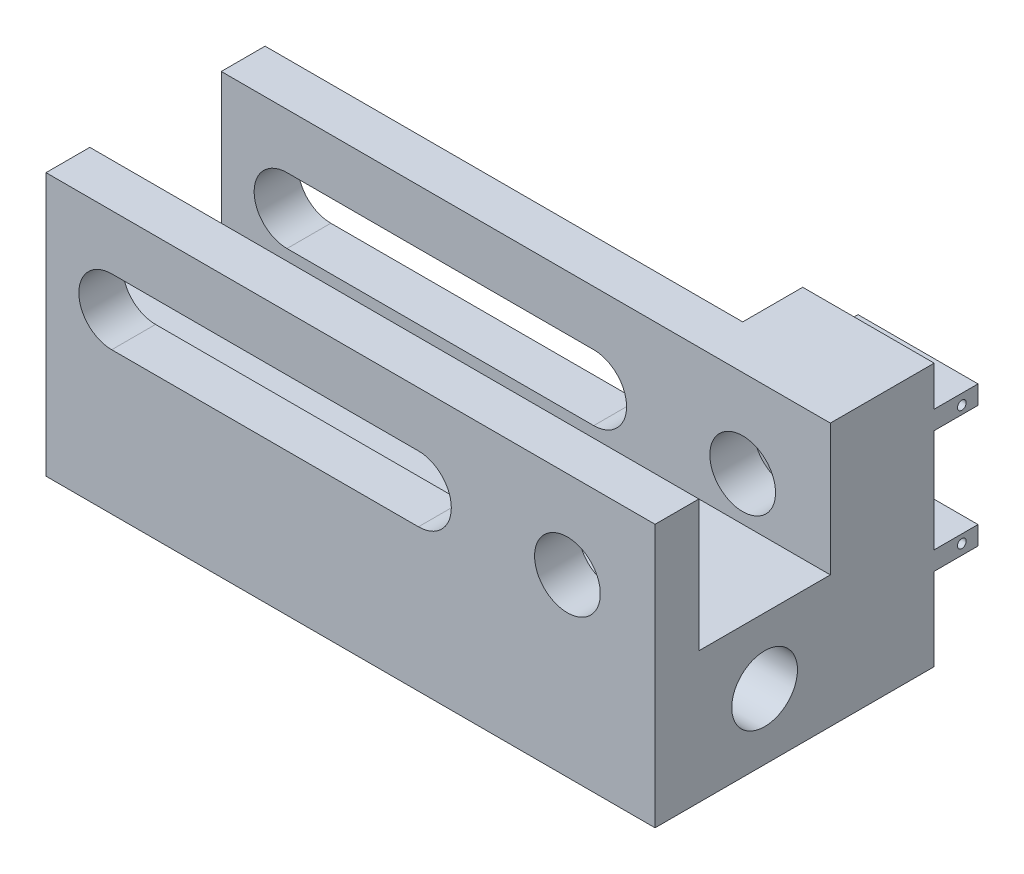
ISO-10303-21;
HEADER;
FILE_DESCRIPTION(('STEP AP214'),'2;1');
FILE_NAME('part.step','',(''),(''),'','','');
FILE_SCHEMA(('AUTOMOTIVE_DESIGN { 1 0 10303 214 1 1 1 1 }'));
ENDSEC;
DATA;
#1=APPLICATION_CONTEXT('core data for automotive mechanical design processes');
#2=APPLICATION_PROTOCOL_DEFINITION('international standard','automotive_design',2000,#1);
#3=PRODUCT_CONTEXT('',#1,'mechanical');
#4=PRODUCT('Part','Part','',(#3));
#5=PRODUCT_RELATED_PRODUCT_CATEGORY('part','',(#4));
#6=PRODUCT_DEFINITION_FORMATION('','',#4);
#7=PRODUCT_DEFINITION_CONTEXT('part definition',#1,'design');
#8=PRODUCT_DEFINITION('design','',#6,#7);
#9=PRODUCT_DEFINITION_SHAPE('','',#8);
#10=(LENGTH_UNIT() NAMED_UNIT(*) SI_UNIT(.MILLI.,.METRE.));
#11=(NAMED_UNIT(*) PLANE_ANGLE_UNIT() SI_UNIT($,.RADIAN.));
#12=(NAMED_UNIT(*) SI_UNIT($,.STERADIAN.) SOLID_ANGLE_UNIT());
#13=UNCERTAINTY_MEASURE_WITH_UNIT(LENGTH_MEASURE(1.E-05),#10,'distance_accuracy_value','');
#14=(GEOMETRIC_REPRESENTATION_CONTEXT(3) GLOBAL_UNCERTAINTY_ASSIGNED_CONTEXT((#13)) GLOBAL_UNIT_ASSIGNED_CONTEXT((#10,
#11,#12)) REPRESENTATION_CONTEXT('',''));
#15=CARTESIAN_POINT('',(0.,0.,0.));
#16=DIRECTION('',(0.,0.,1.));
#17=DIRECTION('',(1.,0.,0.));
#18=AXIS2_PLACEMENT_3D('',#15,#16,#17);
#19=CARTESIAN_POINT('',(0.,0.,-38.7));
#20=DIRECTION('',(0.,0.,1.));
#21=DIRECTION('',(1.,0.,0.));
#22=AXIS2_PLACEMENT_3D('',#19,#20,#21);
#23=PLANE('',#22);
#24=DIRECTION('',(-1.,0.,0.));
#25=VECTOR('',#24,1.);
#26=CARTESIAN_POINT('',(0.,18.8499999999997,-38.7));
#27=LINE('',#26,#25);
#28=CARTESIAN_POINT('',(139.,18.85,-38.7));
#29=VERTEX_POINT('',#28);
#30=CARTESIAN_POINT('',(111.417721642696,18.8499999999999,-38.7));
#31=VERTEX_POINT('',#30);
#32=EDGE_CURVE('E238',#29,#31,#27,.T.);
#33=ORIENTED_EDGE('',*,*,#32,.F.);
#34=DIRECTION('',(0.,-1.,0.));
#35=VECTOR('',#34,1.);
#36=CARTESIAN_POINT('',(139.,0.,-38.7));
#37=LINE('',#36,#35);
#38=CARTESIAN_POINT('',(139.,0.,-38.7));
#39=VERTEX_POINT('',#38);
#40=EDGE_CURVE('E242',#29,#39,#37,.T.);
#41=ORIENTED_EDGE('',*,*,#40,.T.);
#42=DIRECTION('',(-1.,0.,0.));
#43=VECTOR('',#42,1.);
#44=CARTESIAN_POINT('',(139.,0.,-38.7));
#45=LINE('',#44,#43);
#46=CARTESIAN_POINT('',(109.,0.,-38.7));
#47=VERTEX_POINT('',#46);
#48=EDGE_CURVE('E276',#39,#47,#45,.T.);
#49=ORIENTED_EDGE('',*,*,#48,.T.);
#50=DIRECTION('',(0.,1.,0.));
#51=VECTOR('',#50,1.);
#52=CARTESIAN_POINT('',(109.,0.,-38.7));
#53=LINE('',#52,#51);
#54=CARTESIAN_POINT('',(109.,60.,-38.7));
#55=VERTEX_POINT('',#54);
#56=EDGE_CURVE('E279',#47,#55,#53,.T.);
#57=ORIENTED_EDGE('',*,*,#56,.T.);
#58=DIRECTION('',(1.,0.,0.));
#59=VECTOR('',#58,1.);
#60=CARTESIAN_POINT('',(139.,60.,-38.7));
#61=LINE('',#60,#59);
#62=CARTESIAN_POINT('',(139.,60.,-38.7));
#63=VERTEX_POINT('',#62);
#64=EDGE_CURVE('E281',#55,#63,#61,.T.);
#65=ORIENTED_EDGE('',*,*,#64,.T.);
#66=CARTESIAN_POINT('',(139.,50.9,-38.7));
#67=VERTEX_POINT('',#66);
#68=EDGE_CURVE('E273',#63,#67,#37,.T.);
#69=ORIENTED_EDGE('',*,*,#68,.T.);
#70=DIRECTION('',(-1.,0.,0.));
#71=VECTOR('',#70,1.);
#72=CARTESIAN_POINT('',(-1.03187819537934E-13,50.8999999999997,-38.7));
#73=LINE('',#72,#71);
#74=CARTESIAN_POINT('',(111.617721642696,50.8999999999999,-38.7));
#75=VERTEX_POINT('',#74);
#76=EDGE_CURVE('E261',#67,#75,#73,.T.);
#77=ORIENTED_EDGE('',*,*,#76,.T.);
#78=DIRECTION('',(0.,-1.,0.));
#79=VECTOR('',#78,1.);
#80=CARTESIAN_POINT('',(111.617721642696,0.,-38.7));
#81=LINE('',#80,#79);
#82=CARTESIAN_POINT('',(111.617721642696,46.6499999999999,-38.7));
#83=VERTEX_POINT('',#82);
#84=EDGE_CURVE('E66',#75,#83,#81,.T.);
#85=ORIENTED_EDGE('',*,*,#84,.T.);
#86=DIRECTION('',(-1.,0.,0.));
#87=VECTOR('',#86,1.);
#88=CARTESIAN_POINT('',(0.,46.6499999999997,-38.7));
#89=LINE('',#88,#87);
#90=CARTESIAN_POINT('',(139.,46.65,-38.7));
#91=VERTEX_POINT('',#90);
#92=EDGE_CURVE('E252',#91,#83,#89,.T.);
#93=ORIENTED_EDGE('',*,*,#92,.F.);
#94=CARTESIAN_POINT('',(139.,23.1,-38.7));
#95=VERTEX_POINT('',#94);
#96=EDGE_CURVE('E277',#91,#95,#37,.T.);
#97=ORIENTED_EDGE('',*,*,#96,.T.);
#98=DIRECTION('',(-1.,0.,0.));
#99=VECTOR('',#98,1.);
#100=CARTESIAN_POINT('',(0.,23.0999999999997,-38.7));
#101=LINE('',#100,#99);
#102=CARTESIAN_POINT('',(111.417721642696,23.0999999999999,-38.7));
#103=VERTEX_POINT('',#102);
#104=EDGE_CURVE('E235',#95,#103,#101,.T.);
#105=ORIENTED_EDGE('',*,*,#104,.T.);
#106=DIRECTION('',(0.,1.,0.));
#107=VECTOR('',#106,1.);
#108=CARTESIAN_POINT('',(111.417721642696,0.,-38.7));
#109=LINE('',#108,#107);
#110=EDGE_CURVE('E58',#31,#103,#109,.T.);
#111=ORIENTED_EDGE('',*,*,#110,.F.);
#112=EDGE_LOOP('',(#33,#41,#49,#57,#65,#69,#77,#85,#93,#97,#105,#111));
#113=FACE_BOUND('',#112,.T.);
#114=ADVANCED_FACE('F41',(#113),#23,.F.);
#115=CARTESIAN_POINT('',(139.,51.1347174362356,-25.));
#116=DIRECTION('',(0.,0.,1.));
#117=DIRECTION('',(1.,0.,0.));
#118=AXIS2_PLACEMENT_3D('',#115,#116,#117);
#119=PLANE('',#118);
#120=DIRECTION('',(-1.,0.,0.));
#121=VECTOR('',#120,1.);
#122=CARTESIAN_POINT('',(85.,32.5,-25.));
#123=LINE('',#122,#121);
#124=CARTESIAN_POINT('',(85.,32.5,-25.));
#125=VERTEX_POINT('',#124);
#126=CARTESIAN_POINT('',(15.,32.5,-25.));
#127=VERTEX_POINT('',#126);
#128=EDGE_CURVE('E327',#125,#127,#123,.T.);
#129=ORIENTED_EDGE('',*,*,#128,.F.);
#130=CARTESIAN_POINT('',(85.,40.,-25.));
#131=DIRECTION('',(0.,0.,-1.));
#132=DIRECTION('',(-1.,0.,0.));
#133=AXIS2_PLACEMENT_3D('',#130,#131,#132);
#134=CIRCLE('',#133,7.5);
#135=CARTESIAN_POINT('',(85.,47.5,-25.));
#136=VERTEX_POINT('',#135);
#137=EDGE_CURVE('E302',#136,#125,#134,.T.);
#138=ORIENTED_EDGE('',*,*,#137,.F.);
#139=DIRECTION('',(1.,0.,0.));
#140=VECTOR('',#139,1.);
#141=CARTESIAN_POINT('',(85.,47.5,-25.));
#142=LINE('',#141,#140);
#143=CARTESIAN_POINT('',(15.,47.5,-25.));
#144=VERTEX_POINT('',#143);
#145=EDGE_CURVE('E320',#144,#136,#142,.T.);
#146=ORIENTED_EDGE('',*,*,#145,.F.);
#147=CARTESIAN_POINT('',(15.,40.,-25.));
#148=DIRECTION('',(0.,0.,-1.));
#149=DIRECTION('',(-1.,0.,0.));
#150=AXIS2_PLACEMENT_3D('',#147,#148,#149);
#151=CIRCLE('',#150,7.5);
#152=EDGE_CURVE('E323',#127,#144,#151,.T.);
#153=ORIENTED_EDGE('',*,*,#152,.F.);
#154=EDGE_LOOP('',(#129,#138,#146,#153));
#155=FACE_BOUND('',#154,.T.);
#156=DIRECTION('',(0.,1.,0.));
#157=VECTOR('',#156,1.);
#158=CARTESIAN_POINT('',(109.,0.,-25.));
#159=LINE('',#158,#157);
#160=CARTESIAN_POINT('',(109.,0.,-25.));
#161=VERTEX_POINT('',#160);
#162=CARTESIAN_POINT('',(109.,60.,-25.));
#163=VERTEX_POINT('',#162);
#164=EDGE_CURVE('E239',#161,#163,#159,.T.);
#165=ORIENTED_EDGE('',*,*,#164,.F.);
#166=DIRECTION('',(-1.,0.,0.));
#167=VECTOR('',#166,1.);
#168=CARTESIAN_POINT('',(139.,0.,-25.));
#169=LINE('',#168,#167);
#170=CARTESIAN_POINT('',(0.,0.,-25.));
#171=VERTEX_POINT('',#170);
#172=EDGE_CURVE('E387',#161,#171,#169,.T.);
#173=ORIENTED_EDGE('',*,*,#172,.T.);
#174=DIRECTION('',(0.,1.,0.));
#175=VECTOR('',#174,1.);
#176=CARTESIAN_POINT('',(0.,51.1347174362356,-25.));
#177=LINE('',#176,#175);
#178=CARTESIAN_POINT('',(0.,60.,-25.));
#179=VERTEX_POINT('',#178);
#180=EDGE_CURVE('E370',#171,#179,#177,.T.);
#181=ORIENTED_EDGE('',*,*,#180,.T.);
#182=DIRECTION('',(-1.,0.,0.));
#183=VECTOR('',#182,1.);
#184=CARTESIAN_POINT('',(139.,60.,-25.));
#185=LINE('',#184,#183);
#186=EDGE_CURVE('E11',#163,#179,#185,.T.);
#187=ORIENTED_EDGE('',*,*,#186,.F.);
#188=EDGE_LOOP('',(#165,#173,#181,#187));
#189=FACE_BOUND('',#188,.T.);
#190=ADVANCED_FACE('F43',(#155,#189),#119,.F.);
#191=CARTESIAN_POINT('',(139.,60.,-25.));
#192=DIRECTION('',(0.,-1.,0.));
#193=DIRECTION('',(0.,0.,-1.));
#194=AXIS2_PLACEMENT_3D('',#191,#192,#193);
#195=PLANE('',#194);
#196=DIRECTION('',(0.,0.,1.));
#197=VECTOR('',#196,1.);
#198=CARTESIAN_POINT('',(0.,60.,-25.));
#199=LINE('',#198,#197);
#200=CARTESIAN_POINT('',(0.,60.,-15.));
#201=VERTEX_POINT('',#200);
#202=EDGE_CURVE('E390',#179,#201,#199,.T.);
#203=ORIENTED_EDGE('',*,*,#202,.T.);
#204=DIRECTION('',(-1.,0.,0.));
#205=VECTOR('',#204,1.);
#206=CARTESIAN_POINT('',(139.,60.,-15.));
#207=LINE('',#206,#205);
#208=CARTESIAN_POINT('',(139.,60.,-15.));
#209=VERTEX_POINT('',#208);
#210=EDGE_CURVE('E50',#209,#201,#207,.T.);
#211=ORIENTED_EDGE('',*,*,#210,.F.);
#212=DIRECTION('',(0.,0.,1.));
#213=VECTOR('',#212,1.);
#214=CARTESIAN_POINT('',(139.,60.,-25.));
#215=LINE('',#214,#213);
#216=EDGE_CURVE('E371',#63,#209,#215,.T.);
#217=ORIENTED_EDGE('',*,*,#216,.F.);
#218=ORIENTED_EDGE('',*,*,#64,.F.);
#219=DIRECTION('',(0.,0.,1.));
#220=VECTOR('',#219,1.);
#221=CARTESIAN_POINT('',(109.,60.,-38.7));
#222=LINE('',#221,#220);
#223=EDGE_CURVE('E283',#55,#163,#222,.T.);
#224=ORIENTED_EDGE('',*,*,#223,.T.);
#225=ORIENTED_EDGE('',*,*,#186,.T.);
#226=EDGE_LOOP('',(#203,#211,#217,#218,#224,#225));
#227=FACE_BOUND('',#226,.T.);
#228=ADVANCED_FACE('F494',(#227),#195,.F.);
#229=CARTESIAN_POINT('',(139.,30.,-15.));
#230=DIRECTION('',(0.,0.,-1.));
#231=DIRECTION('',(-1.,0.,0.));
#232=AXIS2_PLACEMENT_3D('',#229,#230,#231);
#233=PLANE('',#232);
#234=CARTESIAN_POINT('',(119.,40.,-15.));
#235=DIRECTION('',(0.,0.,-1.));
#236=DIRECTION('',(-1.,0.,0.));
#237=AXIS2_PLACEMENT_3D('',#234,#235,#236);
#238=CIRCLE('',#237,7.49999999999998);
#239=CARTESIAN_POINT('',(111.5,40.,-15.));
#240=VERTEX_POINT('',#239);
#241=EDGE_CURVE('E367',#240,#240,#238,.T.);
#242=ORIENTED_EDGE('',*,*,#241,.T.);
#243=EDGE_LOOP('',(#242));
#244=FACE_BOUND('',#243,.T.);
#245=DIRECTION('',(1.,0.,0.));
#246=VECTOR('',#245,1.);
#247=CARTESIAN_POINT('',(139.,47.5,-15.));
#248=LINE('',#247,#246);
#249=CARTESIAN_POINT('',(15.,47.5,-15.));
#250=VERTEX_POINT('',#249);
#251=CARTESIAN_POINT('',(85.,47.5,-15.));
#252=VERTEX_POINT('',#251);
#253=EDGE_CURVE('E355',#250,#252,#248,.T.);
#254=ORIENTED_EDGE('',*,*,#253,.T.);
#255=CARTESIAN_POINT('',(85.,40.,-15.));
#256=DIRECTION('',(0.,0.,-1.));
#257=DIRECTION('',(-1.,0.,0.));
#258=AXIS2_PLACEMENT_3D('',#255,#256,#257);
#259=CIRCLE('',#258,7.5);
#260=CARTESIAN_POINT('',(85.,32.5,-15.));
#261=VERTEX_POINT('',#260);
#262=EDGE_CURVE('E361',#252,#261,#259,.T.);
#263=ORIENTED_EDGE('',*,*,#262,.T.);
#264=DIRECTION('',(-1.,0.,0.));
#265=VECTOR('',#264,1.);
#266=CARTESIAN_POINT('',(139.,32.5,-15.));
#267=LINE('',#266,#265);
#268=CARTESIAN_POINT('',(15.,32.5,-15.));
#269=VERTEX_POINT('',#268);
#270=EDGE_CURVE('E343',#261,#269,#267,.T.);
#271=ORIENTED_EDGE('',*,*,#270,.T.);
#272=CARTESIAN_POINT('',(15.,40.,-15.));
#273=DIRECTION('',(0.,0.,-1.));
#274=DIRECTION('',(-1.,0.,0.));
#275=AXIS2_PLACEMENT_3D('',#272,#273,#274);
#276=CIRCLE('',#275,7.5);
#277=EDGE_CURVE('E349',#269,#250,#276,.T.);
#278=ORIENTED_EDGE('',*,*,#277,.T.);
#279=EDGE_LOOP('',(#254,#263,#271,#278));
#280=FACE_BOUND('',#279,.T.);
#281=DIRECTION('',(0.,-1.,0.));
#282=VECTOR('',#281,1.);
#283=CARTESIAN_POINT('',(0.,30.,-15.));
#284=LINE('',#283,#282);
#285=CARTESIAN_POINT('',(0.,30.,-15.));
#286=VERTEX_POINT('',#285);
#287=EDGE_CURVE('E392',#201,#286,#284,.T.);
#288=ORIENTED_EDGE('',*,*,#287,.T.);
#289=DIRECTION('',(-1.,0.,0.));
#290=VECTOR('',#289,1.);
#291=CARTESIAN_POINT('',(139.,30.,-15.));
#292=LINE('',#291,#290);
#293=CARTESIAN_POINT('',(139.,30.,-15.));
#294=VERTEX_POINT('',#293);
#295=EDGE_CURVE('E417',#294,#286,#292,.T.);
#296=ORIENTED_EDGE('',*,*,#295,.F.);
#297=DIRECTION('',(0.,-1.,0.));
#298=VECTOR('',#297,1.);
#299=CARTESIAN_POINT('',(139.,30.,-15.));
#300=LINE('',#299,#298);
#301=EDGE_CURVE('E373',#209,#294,#300,.T.);
#302=ORIENTED_EDGE('',*,*,#301,.F.);
#303=ORIENTED_EDGE('',*,*,#210,.T.);
#304=EDGE_LOOP('',(#288,#296,#302,#303));
#305=FACE_BOUND('',#304,.T.);
#306=ADVANCED_FACE('F555',(#244,#280,#305),#233,.F.);
#307=CARTESIAN_POINT('',(139.,30.,15.));
#308=DIRECTION('',(0.,-1.,0.));
#309=DIRECTION('',(0.,0.,-1.));
#310=AXIS2_PLACEMENT_3D('',#307,#308,#309);
#311=PLANE('',#310);
#312=DIRECTION('',(0.,0.,1.));
#313=VECTOR('',#312,1.);
#314=CARTESIAN_POINT('',(0.,30.,15.));
#315=LINE('',#314,#313);
#316=CARTESIAN_POINT('',(0.,30.,15.));
#317=VERTEX_POINT('',#316);
#318=EDGE_CURVE('E394',#286,#317,#315,.T.);
#319=ORIENTED_EDGE('',*,*,#318,.T.);
#320=DIRECTION('',(-1.,0.,0.));
#321=VECTOR('',#320,1.);
#322=CARTESIAN_POINT('',(139.,30.,15.));
#323=LINE('',#322,#321);
#324=CARTESIAN_POINT('',(139.,30.,15.));
#325=VERTEX_POINT('',#324);
#326=EDGE_CURVE('E414',#325,#317,#323,.T.);
#327=ORIENTED_EDGE('',*,*,#326,.F.);
#328=DIRECTION('',(0.,0.,1.));
#329=VECTOR('',#328,1.);
#330=CARTESIAN_POINT('',(139.,30.,15.));
#331=LINE('',#330,#329);
#332=EDGE_CURVE('E376',#294,#325,#331,.T.);
#333=ORIENTED_EDGE('',*,*,#332,.F.);
#334=ORIENTED_EDGE('',*,*,#295,.T.);
#335=EDGE_LOOP('',(#319,#327,#333,#334));
#336=FACE_BOUND('',#335,.T.);
#337=ADVANCED_FACE('F551',(#336),#311,.F.);
#338=CARTESIAN_POINT('',(139.,30.,15.));
#339=DIRECTION('',(0.,0.,1.));
#340=DIRECTION('',(1.,0.,0.));
#341=AXIS2_PLACEMENT_3D('',#338,#339,#340);
#342=PLANE('',#341);
#343=CARTESIAN_POINT('',(119.,40.,15.));
#344=DIRECTION('',(0.,0.,1.));
#345=DIRECTION('',(1.,0.,0.));
#346=AXIS2_PLACEMENT_3D('',#343,#344,#345);
#347=CIRCLE('',#346,7.49999999999998);
#348=CARTESIAN_POINT('',(126.5,40.,15.));
#349=VERTEX_POINT('',#348);
#350=EDGE_CURVE('E364',#349,#349,#347,.T.);
#351=ORIENTED_EDGE('',*,*,#350,.T.);
#352=EDGE_LOOP('',(#351));
#353=FACE_BOUND('',#352,.T.);
#354=DIRECTION('',(1.,0.,0.));
#355=VECTOR('',#354,1.);
#356=CARTESIAN_POINT('',(139.,32.5,15.));
#357=LINE('',#356,#355);
#358=CARTESIAN_POINT('',(15.,32.5,15.));
#359=VERTEX_POINT('',#358);
#360=CARTESIAN_POINT('',(85.,32.5,15.));
#361=VERTEX_POINT('',#360);
#362=EDGE_CURVE('E301',#359,#361,#357,.T.);
#363=ORIENTED_EDGE('',*,*,#362,.T.);
#364=CARTESIAN_POINT('',(85.,40.,15.));
#365=DIRECTION('',(0.,0.,1.));
#366=DIRECTION('',(1.,0.,0.));
#367=AXIS2_PLACEMENT_3D('',#364,#365,#366);
#368=CIRCLE('',#367,7.5);
#369=CARTESIAN_POINT('',(85.,47.5,15.));
#370=VERTEX_POINT('',#369);
#371=EDGE_CURVE('E358',#361,#370,#368,.T.);
#372=ORIENTED_EDGE('',*,*,#371,.T.);
#373=DIRECTION('',(-1.,0.,0.));
#374=VECTOR('',#373,1.);
#375=CARTESIAN_POINT('',(139.,47.5,15.));
#376=LINE('',#375,#374);
#377=CARTESIAN_POINT('',(15.,47.5,15.));
#378=VERTEX_POINT('',#377);
#379=EDGE_CURVE('E352',#370,#378,#376,.T.);
#380=ORIENTED_EDGE('',*,*,#379,.T.);
#381=CARTESIAN_POINT('',(15.,40.,15.));
#382=DIRECTION('',(0.,0.,1.));
#383=DIRECTION('',(1.,0.,0.));
#384=AXIS2_PLACEMENT_3D('',#381,#382,#383);
#385=CIRCLE('',#384,7.5);
#386=EDGE_CURVE('E346',#378,#359,#385,.T.);
#387=ORIENTED_EDGE('',*,*,#386,.T.);
#388=EDGE_LOOP('',(#363,#372,#380,#387));
#389=FACE_BOUND('',#388,.T.);
#390=DIRECTION('',(0.,1.,0.));
#391=VECTOR('',#390,1.);
#392=CARTESIAN_POINT('',(0.,30.,15.));
#393=LINE('',#392,#391);
#394=CARTESIAN_POINT('',(0.,60.,15.));
#395=VERTEX_POINT('',#394);
#396=EDGE_CURVE('E396',#317,#395,#393,.T.);
#397=ORIENTED_EDGE('',*,*,#396,.T.);
#398=DIRECTION('',(-1.,0.,0.));
#399=VECTOR('',#398,1.);
#400=CARTESIAN_POINT('',(139.,60.,15.));
#401=LINE('',#400,#399);
#402=CARTESIAN_POINT('',(139.,60.,15.));
#403=VERTEX_POINT('',#402);
#404=EDGE_CURVE('E411',#403,#395,#401,.T.);
#405=ORIENTED_EDGE('',*,*,#404,.F.);
#406=DIRECTION('',(0.,1.,0.));
#407=VECTOR('',#406,1.);
#408=CARTESIAN_POINT('',(139.,30.,15.));
#409=LINE('',#408,#407);
#410=EDGE_CURVE('E378',#325,#403,#409,.T.);
#411=ORIENTED_EDGE('',*,*,#410,.F.);
#412=ORIENTED_EDGE('',*,*,#326,.T.);
#413=EDGE_LOOP('',(#397,#405,#411,#412));
#414=FACE_BOUND('',#413,.T.);
#415=ADVANCED_FACE('F547',(#353,#389,#414),#342,.F.);
#416=CARTESIAN_POINT('',(139.,60.,25.));
#417=DIRECTION('',(0.,-1.,0.));
#418=DIRECTION('',(0.,0.,-1.));
#419=AXIS2_PLACEMENT_3D('',#416,#417,#418);
#420=PLANE('',#419);
#421=DIRECTION('',(0.,0.,1.));
#422=VECTOR('',#421,1.);
#423=CARTESIAN_POINT('',(0.,60.,25.));
#424=LINE('',#423,#422);
#425=CARTESIAN_POINT('',(0.,60.,25.));
#426=VERTEX_POINT('',#425);
#427=EDGE_CURVE('E398',#395,#426,#424,.T.);
#428=ORIENTED_EDGE('',*,*,#427,.T.);
#429=DIRECTION('',(-1.,0.,0.));
#430=VECTOR('',#429,1.);
#431=CARTESIAN_POINT('',(139.,60.,25.));
#432=LINE('',#431,#430);
#433=CARTESIAN_POINT('',(139.,60.,25.));
#434=VERTEX_POINT('',#433);
#435=EDGE_CURVE('E408',#434,#426,#432,.T.);
#436=ORIENTED_EDGE('',*,*,#435,.F.);
#437=DIRECTION('',(0.,0.,1.));
#438=VECTOR('',#437,1.);
#439=CARTESIAN_POINT('',(139.,60.,25.));
#440=LINE('',#439,#438);
#441=EDGE_CURVE('E380',#403,#434,#440,.T.);
#442=ORIENTED_EDGE('',*,*,#441,.F.);
#443=ORIENTED_EDGE('',*,*,#404,.T.);
#444=EDGE_LOOP('',(#428,#436,#442,#443));
#445=FACE_BOUND('',#444,.T.);
#446=ADVANCED_FACE('F543',(#445),#420,.F.);
#447=CARTESIAN_POINT('',(139.,60.,25.));
#448=DIRECTION('',(0.,0.,-1.));
#449=DIRECTION('',(0.,1.,0.));
#450=AXIS2_PLACEMENT_3D('',#447,#448,#449);
#451=PLANE('',#450);
#452=CARTESIAN_POINT('',(119.,40.,25.));
#453=DIRECTION('',(0.,0.,-1.));
#454=DIRECTION('',(-1.,0.,0.));
#455=AXIS2_PLACEMENT_3D('',#452,#453,#454);
#456=CIRCLE('',#455,7.49999999999998);
#457=CARTESIAN_POINT('',(111.5,40.,25.));
#458=VERTEX_POINT('',#457);
#459=EDGE_CURVE('E298',#458,#458,#456,.T.);
#460=ORIENTED_EDGE('',*,*,#459,.T.);
#461=EDGE_LOOP('',(#460));
#462=FACE_BOUND('',#461,.T.);
#463=DIRECTION('',(1.,0.,0.));
#464=VECTOR('',#463,1.);
#465=CARTESIAN_POINT('',(85.,47.5,25.));
#466=LINE('',#465,#464);
#467=CARTESIAN_POINT('',(15.,47.5,25.));
#468=VERTEX_POINT('',#467);
#469=CARTESIAN_POINT('',(85.,47.5,25.));
#470=VERTEX_POINT('',#469);
#471=EDGE_CURVE('E307',#468,#470,#466,.T.);
#472=ORIENTED_EDGE('',*,*,#471,.T.);
#473=CARTESIAN_POINT('',(85.,40.,25.));
#474=DIRECTION('',(0.,0.,-1.));
#475=DIRECTION('',(-1.,0.,0.));
#476=AXIS2_PLACEMENT_3D('',#473,#474,#475);
#477=CIRCLE('',#476,7.5);
#478=CARTESIAN_POINT('',(85.,32.5,25.));
#479=VERTEX_POINT('',#478);
#480=EDGE_CURVE('E324',#470,#479,#477,.T.);
#481=ORIENTED_EDGE('',*,*,#480,.T.);
#482=DIRECTION('',(-1.,0.,0.));
#483=VECTOR('',#482,1.);
#484=CARTESIAN_POINT('',(85.,32.5,25.));
#485=LINE('',#484,#483);
#486=CARTESIAN_POINT('',(15.,32.5,25.));
#487=VERTEX_POINT('',#486);
#488=EDGE_CURVE('E336',#479,#487,#485,.T.);
#489=ORIENTED_EDGE('',*,*,#488,.T.);
#490=CARTESIAN_POINT('',(15.,40.,25.));
#491=DIRECTION('',(0.,0.,-1.));
#492=DIRECTION('',(-1.,0.,0.));
#493=AXIS2_PLACEMENT_3D('',#490,#491,#492);
#494=CIRCLE('',#493,7.5);
#495=EDGE_CURVE('E333',#487,#468,#494,.T.);
#496=ORIENTED_EDGE('',*,*,#495,.T.);
#497=EDGE_LOOP('',(#472,#481,#489,#496));
#498=FACE_BOUND('',#497,.T.);
#499=DIRECTION('',(0.,-1.,0.));
#500=VECTOR('',#499,1.);
#501=CARTESIAN_POINT('',(0.,60.,25.));
#502=LINE('',#501,#500);
#503=CARTESIAN_POINT('',(0.,0.,25.));
#504=VERTEX_POINT('',#503);
#505=EDGE_CURVE('E400',#426,#504,#502,.T.);
#506=ORIENTED_EDGE('',*,*,#505,.T.);
#507=DIRECTION('',(-1.,0.,0.));
#508=VECTOR('',#507,1.);
#509=CARTESIAN_POINT('',(139.,0.,25.));
#510=LINE('',#509,#508);
#511=CARTESIAN_POINT('',(139.,0.,25.));
#512=VERTEX_POINT('',#511);
#513=EDGE_CURVE('E405',#512,#504,#510,.T.);
#514=ORIENTED_EDGE('',*,*,#513,.F.);
#515=DIRECTION('',(0.,-1.,0.));
#516=VECTOR('',#515,1.);
#517=CARTESIAN_POINT('',(139.,60.,25.));
#518=LINE('',#517,#516);
#519=EDGE_CURVE('E382',#434,#512,#518,.T.);
#520=ORIENTED_EDGE('',*,*,#519,.F.);
#521=ORIENTED_EDGE('',*,*,#435,.T.);
#522=EDGE_LOOP('',(#506,#514,#520,#521));
#523=FACE_BOUND('',#522,.T.);
#524=ADVANCED_FACE('F540',(#462,#498,#523),#451,.F.);
#525=CARTESIAN_POINT('',(139.,0.,25.));
#526=DIRECTION('',(0.,1.,0.));
#527=DIRECTION('',(0.,0.,1.));
#528=AXIS2_PLACEMENT_3D('',#525,#526,#527);
#529=PLANE('',#528);
#530=DIRECTION('',(0.,0.,-1.));
#531=VECTOR('',#530,1.);
#532=CARTESIAN_POINT('',(0.,0.,25.));
#533=LINE('',#532,#531);
#534=EDGE_CURVE('E374',#504,#171,#533,.T.);
#535=ORIENTED_EDGE('',*,*,#534,.T.);
#536=ORIENTED_EDGE('',*,*,#172,.F.);
#537=DIRECTION('',(0.,0.,1.));
#538=VECTOR('',#537,1.);
#539=CARTESIAN_POINT('',(109.,0.,-38.7));
#540=LINE('',#539,#538);
#541=EDGE_CURVE('E287',#47,#161,#540,.T.);
#542=ORIENTED_EDGE('',*,*,#541,.F.);
#543=ORIENTED_EDGE('',*,*,#48,.F.);
#544=DIRECTION('',(0.,0.,-1.));
#545=VECTOR('',#544,1.);
#546=CARTESIAN_POINT('',(139.,0.,25.));
#547=LINE('',#546,#545);
#548=EDGE_CURVE('E384',#512,#39,#547,.T.);
#549=ORIENTED_EDGE('',*,*,#548,.F.);
#550=ORIENTED_EDGE('',*,*,#513,.T.);
#551=EDGE_LOOP('',(#535,#536,#542,#543,#549,#550));
#552=FACE_BOUND('',#551,.T.);
#553=ADVANCED_FACE('F457',(#552),#529,.F.);
#554=CARTESIAN_POINT('',(139.,0.,0.));
#555=DIRECTION('',(1.,0.,0.));
#556=DIRECTION('',(0.,0.,-1.));
#557=AXIS2_PLACEMENT_3D('',#554,#555,#556);
#558=PLANE('',#557);
#559=CARTESIAN_POINT('',(139.,48.5294397209159,-45.013158898505));
#560=DIRECTION('',(-1.,0.,0.));
#561=DIRECTION('',(0.,0.,1.));
#562=AXIS2_PLACEMENT_3D('',#559,#560,#561);
#563=CIRCLE('',#562,1.00000000000001);
#564=CARTESIAN_POINT('',(139.,48.5294397209159,-44.013158898505));
#565=VERTEX_POINT('',#564);
#566=EDGE_CURVE('E423',#565,#565,#563,.T.);
#567=ORIENTED_EDGE('',*,*,#566,.T.);
#568=EDGE_LOOP('',(#567));
#569=FACE_BOUND('',#568,.T.);
#570=CARTESIAN_POINT('',(139.,21.1906617467358,-45.013158898505));
#571=DIRECTION('',(-1.,0.,0.));
#572=DIRECTION('',(0.,0.,1.));
#573=AXIS2_PLACEMENT_3D('',#570,#571,#572);
#574=CIRCLE('',#573,0.999999999999998);
#575=CARTESIAN_POINT('',(139.,21.1906617467358,-44.013158898505));
#576=VERTEX_POINT('',#575);
#577=EDGE_CURVE('E428',#576,#576,#574,.T.);
#578=ORIENTED_EDGE('',*,*,#577,.T.);
#579=EDGE_LOOP('',(#578));
#580=FACE_BOUND('',#579,.T.);
#581=CARTESIAN_POINT('',(139.,15.,0.));
#582=DIRECTION('',(1.,0.,0.));
#583=DIRECTION('',(0.,0.,-1.));
#584=AXIS2_PLACEMENT_3D('',#581,#582,#583);
#585=CIRCLE('',#584,7.5);
#586=CARTESIAN_POINT('',(139.,15.,-7.49999999999999));
#587=VERTEX_POINT('',#586);
#588=EDGE_CURVE('E294',#587,#587,#585,.T.);
#589=ORIENTED_EDGE('',*,*,#588,.F.);
#590=EDGE_LOOP('',(#589));
#591=FACE_BOUND('',#590,.T.);
#592=ORIENTED_EDGE('',*,*,#548,.T.);
#593=ORIENTED_EDGE('',*,*,#40,.F.);
#594=DIRECTION('',(0.,0.,1.));
#595=VECTOR('',#594,1.);
#596=CARTESIAN_POINT('',(139.,18.85,-48.7));
#597=LINE('',#596,#595);
#598=CARTESIAN_POINT('',(139.,18.85,-48.7));
#599=VERTEX_POINT('',#598);
#600=EDGE_CURVE('E437',#599,#29,#597,.T.);
#601=ORIENTED_EDGE('',*,*,#600,.F.);
#602=DIRECTION('',(0.,-1.,0.));
#603=VECTOR('',#602,1.);
#604=CARTESIAN_POINT('',(139.,0.,-48.7));
#605=LINE('',#604,#603);
#606=CARTESIAN_POINT('',(139.,23.1,-48.7));
#607=VERTEX_POINT('',#606);
#608=EDGE_CURVE('E231',#607,#599,#605,.T.);
#609=ORIENTED_EDGE('',*,*,#608,.F.);
#610=DIRECTION('',(0.,0.,1.));
#611=VECTOR('',#610,1.);
#612=CARTESIAN_POINT('',(139.,23.1,-48.7));
#613=LINE('',#612,#611);
#614=EDGE_CURVE('E244',#607,#95,#613,.T.);
#615=ORIENTED_EDGE('',*,*,#614,.T.);
#616=ORIENTED_EDGE('',*,*,#96,.F.);
#617=DIRECTION('',(0.,0.,1.));
#618=VECTOR('',#617,1.);
#619=CARTESIAN_POINT('',(139.,46.65,-48.7));
#620=LINE('',#619,#618);
#621=CARTESIAN_POINT('',(139.,46.65,-48.7));
#622=VERTEX_POINT('',#621);
#623=EDGE_CURVE('E267',#622,#91,#620,.T.);
#624=ORIENTED_EDGE('',*,*,#623,.F.);
#625=DIRECTION('',(0.,-1.,0.));
#626=VECTOR('',#625,1.);
#627=CARTESIAN_POINT('',(139.,0.,-48.7));
#628=LINE('',#627,#626);
#629=CARTESIAN_POINT('',(139.,50.9,-48.7));
#630=VERTEX_POINT('',#629);
#631=EDGE_CURVE('E255',#630,#622,#628,.T.);
#632=ORIENTED_EDGE('',*,*,#631,.F.);
#633=DIRECTION('',(0.,0.,1.));
#634=VECTOR('',#633,1.);
#635=CARTESIAN_POINT('',(139.,50.9,-48.7));
#636=LINE('',#635,#634);
#637=EDGE_CURVE('E269',#630,#67,#636,.T.);
#638=ORIENTED_EDGE('',*,*,#637,.T.);
#639=ORIENTED_EDGE('',*,*,#68,.F.);
#640=ORIENTED_EDGE('',*,*,#216,.T.);
#641=ORIENTED_EDGE('',*,*,#301,.T.);
#642=ORIENTED_EDGE('',*,*,#332,.T.);
#643=ORIENTED_EDGE('',*,*,#410,.T.);
#644=ORIENTED_EDGE('',*,*,#441,.T.);
#645=ORIENTED_EDGE('',*,*,#519,.T.);
#646=EDGE_LOOP('',(#592,#593,#601,#609,#615,#616,#624,#632,#638,#639,#640,#641,#642,#643,#644,#645));
#647=FACE_BOUND('',#646,.T.);
#648=ADVANCED_FACE('F445',(#569,#580,#591,#647),#558,.T.);
#649=CARTESIAN_POINT('',(0.,0.,0.));
#650=DIRECTION('',(1.,0.,0.));
#651=DIRECTION('',(0.,0.,-1.));
#652=AXIS2_PLACEMENT_3D('',#649,#650,#651);
#653=PLANE('',#652);
#654=CARTESIAN_POINT('',(0.,15.,0.));
#655=DIRECTION('',(1.,0.,0.));
#656=DIRECTION('',(0.,0.,-1.));
#657=AXIS2_PLACEMENT_3D('',#654,#655,#656);
#658=CIRCLE('',#657,7.5);
#659=CARTESIAN_POINT('',(0.,15.,-7.49999999999999));
#660=VERTEX_POINT('',#659);
#661=EDGE_CURVE('E291',#660,#660,#658,.T.);
#662=ORIENTED_EDGE('',*,*,#661,.T.);
#663=EDGE_LOOP('',(#662));
#664=FACE_BOUND('',#663,.T.);
#665=ORIENTED_EDGE('',*,*,#180,.F.);
#666=ORIENTED_EDGE('',*,*,#534,.F.);
#667=ORIENTED_EDGE('',*,*,#505,.F.);
#668=ORIENTED_EDGE('',*,*,#427,.F.);
#669=ORIENTED_EDGE('',*,*,#396,.F.);
#670=ORIENTED_EDGE('',*,*,#318,.F.);
#671=ORIENTED_EDGE('',*,*,#287,.F.);
#672=ORIENTED_EDGE('',*,*,#202,.F.);
#673=EDGE_LOOP('',(#665,#666,#667,#668,#669,#670,#671,#672));
#674=FACE_BOUND('',#673,.T.);
#675=ADVANCED_FACE('F534',(#664,#674),#653,.F.);
#676=CARTESIAN_POINT('',(85.,32.5,25.));
#677=DIRECTION('',(0.,-1.,0.));
#678=DIRECTION('',(0.,0.,-1.));
#679=AXIS2_PLACEMENT_3D('',#676,#677,#678);
#680=PLANE('',#679);
#681=DIRECTION('',(0.,0.,-1.));
#682=VECTOR('',#681,1.);
#683=CARTESIAN_POINT('',(15.,32.5,25.));
#684=LINE('',#683,#682);
#685=EDGE_CURVE('E309',#487,#359,#684,.T.);
#686=ORIENTED_EDGE('',*,*,#685,.F.);
#687=ORIENTED_EDGE('',*,*,#488,.F.);
#688=DIRECTION('',(0.,0.,-1.));
#689=VECTOR('',#688,1.);
#690=CARTESIAN_POINT('',(85.,32.5,25.));
#691=LINE('',#690,#689);
#692=EDGE_CURVE('E305',#479,#361,#691,.T.);
#693=ORIENTED_EDGE('',*,*,#692,.T.);
#694=ORIENTED_EDGE('',*,*,#362,.F.);
#695=EDGE_LOOP('',(#686,#687,#693,#694));
#696=FACE_BOUND('',#695,.T.);
#697=ADVANCED_FACE('F523',(#696),#680,.F.);
#698=CARTESIAN_POINT('',(15.,40.,25.));
#699=DIRECTION('',(0.,0.,-1.));
#700=DIRECTION('',(-1.,0.,0.));
#701=AXIS2_PLACEMENT_3D('',#698,#699,#700);
#702=CYLINDRICAL_SURFACE('',#701,7.5);
#703=DIRECTION('',(0.,0.,-1.));
#704=VECTOR('',#703,1.);
#705=CARTESIAN_POINT('',(15.,47.5,25.));
#706=LINE('',#705,#704);
#707=EDGE_CURVE('E313',#468,#378,#706,.T.);
#708=ORIENTED_EDGE('',*,*,#707,.F.);
#709=ORIENTED_EDGE('',*,*,#495,.F.);
#710=ORIENTED_EDGE('',*,*,#685,.T.);
#711=ORIENTED_EDGE('',*,*,#386,.F.);
#712=EDGE_LOOP('',(#708,#709,#710,#711));
#713=FACE_BOUND('',#712,.T.);
#714=ADVANCED_FACE('F527',(#713),#702,.F.);
#715=CARTESIAN_POINT('',(85.,47.5,25.));
#716=DIRECTION('',(0.,1.,0.));
#717=DIRECTION('',(0.,0.,1.));
#718=AXIS2_PLACEMENT_3D('',#715,#716,#717);
#719=PLANE('',#718);
#720=DIRECTION('',(0.,0.,-1.));
#721=VECTOR('',#720,1.);
#722=CARTESIAN_POINT('',(85.,47.5,25.));
#723=LINE('',#722,#721);
#724=EDGE_CURVE('E317',#470,#370,#723,.T.);
#725=ORIENTED_EDGE('',*,*,#724,.F.);
#726=ORIENTED_EDGE('',*,*,#471,.F.);
#727=ORIENTED_EDGE('',*,*,#707,.T.);
#728=ORIENTED_EDGE('',*,*,#379,.F.);
#729=EDGE_LOOP('',(#725,#726,#727,#728));
#730=FACE_BOUND('',#729,.T.);
#731=ADVANCED_FACE('F531',(#730),#719,.F.);
#732=CARTESIAN_POINT('',(85.,40.,25.));
#733=DIRECTION('',(0.,0.,-1.));
#734=DIRECTION('',(-1.,0.,0.));
#735=AXIS2_PLACEMENT_3D('',#732,#733,#734);
#736=CYLINDRICAL_SURFACE('',#735,7.5);
#737=ORIENTED_EDGE('',*,*,#692,.F.);
#738=ORIENTED_EDGE('',*,*,#480,.F.);
#739=ORIENTED_EDGE('',*,*,#724,.T.);
#740=ORIENTED_EDGE('',*,*,#371,.F.);
#741=EDGE_LOOP('',(#737,#738,#739,#740));
#742=FACE_BOUND('',#741,.T.);
#743=ADVANCED_FACE('F518',(#742),#736,.F.);
#744=CARTESIAN_POINT('',(119.,40.,25.));
#745=DIRECTION('',(0.,0.,-1.));
#746=DIRECTION('',(-1.,0.,0.));
#747=AXIS2_PLACEMENT_3D('',#744,#745,#746);
#748=CYLINDRICAL_SURFACE('',#747,7.49999999999998);
#749=ORIENTED_EDGE('',*,*,#459,.F.);
#750=EDGE_LOOP('',(#749));
#751=FACE_BOUND('',#750,.T.);
#752=ORIENTED_EDGE('',*,*,#350,.F.);
#753=EDGE_LOOP('',(#752));
#754=FACE_BOUND('',#753,.T.);
#755=ADVANCED_FACE('F512',(#751,#754),#748,.F.);
#756=EDGE_CURVE('E297',#252,#136,#723,.T.);
#757=ORIENTED_EDGE('',*,*,#756,.T.);
#758=ORIENTED_EDGE('',*,*,#137,.T.);
#759=EDGE_CURVE('E308',#261,#125,#691,.T.);
#760=ORIENTED_EDGE('',*,*,#759,.F.);
#761=ORIENTED_EDGE('',*,*,#262,.F.);
#762=EDGE_LOOP('',(#757,#758,#760,#761));
#763=FACE_BOUND('',#762,.T.);
#764=ADVANCED_FACE('F513',(#763),#736,.F.);
#765=EDGE_CURVE('E316',#250,#144,#706,.T.);
#766=ORIENTED_EDGE('',*,*,#765,.T.);
#767=ORIENTED_EDGE('',*,*,#145,.T.);
#768=ORIENTED_EDGE('',*,*,#756,.F.);
#769=ORIENTED_EDGE('',*,*,#253,.F.);
#770=EDGE_LOOP('',(#766,#767,#768,#769));
#771=FACE_BOUND('',#770,.T.);
#772=ADVANCED_FACE('F516',(#771),#719,.F.);
#773=EDGE_CURVE('E312',#269,#127,#684,.T.);
#774=ORIENTED_EDGE('',*,*,#773,.T.);
#775=ORIENTED_EDGE('',*,*,#152,.T.);
#776=ORIENTED_EDGE('',*,*,#765,.F.);
#777=ORIENTED_EDGE('',*,*,#277,.F.);
#778=EDGE_LOOP('',(#774,#775,#776,#777));
#779=FACE_BOUND('',#778,.T.);
#780=ADVANCED_FACE('F521',(#779),#702,.F.);
#781=ORIENTED_EDGE('',*,*,#759,.T.);
#782=ORIENTED_EDGE('',*,*,#128,.T.);
#783=ORIENTED_EDGE('',*,*,#773,.F.);
#784=ORIENTED_EDGE('',*,*,#270,.F.);
#785=EDGE_LOOP('',(#781,#782,#783,#784));
#786=FACE_BOUND('',#785,.T.);
#787=ADVANCED_FACE('F510',(#786),#680,.F.);
#788=CARTESIAN_POINT('',(119.,40.,-25.));
#789=DIRECTION('',(0.,0.,-1.));
#790=DIRECTION('',(-1.,0.,0.));
#791=AXIS2_PLACEMENT_3D('',#788,#789,#790);
#792=CIRCLE('',#791,7.49999999999998);
#793=CARTESIAN_POINT('',(111.5,40.,-25.));
#794=VERTEX_POINT('',#793);
#795=EDGE_CURVE('E290',#794,#794,#792,.T.);
#796=ORIENTED_EDGE('',*,*,#795,.T.);
#797=EDGE_LOOP('',(#796));
#798=FACE_BOUND('',#797,.T.);
#799=ORIENTED_EDGE('',*,*,#241,.F.);
#800=EDGE_LOOP('',(#799));
#801=FACE_BOUND('',#800,.T.);
#802=ADVANCED_FACE('F506',(#798,#801),#748,.F.);
#803=CARTESIAN_POINT('',(0.,15.,0.));
#804=DIRECTION('',(1.,0.,0.));
#805=DIRECTION('',(0.,0.,-1.));
#806=AXIS2_PLACEMENT_3D('',#803,#804,#805);
#807=CYLINDRICAL_SURFACE('',#806,7.5);
#808=ORIENTED_EDGE('',*,*,#588,.T.);
#809=EDGE_LOOP('',(#808));
#810=FACE_BOUND('',#809,.T.);
#811=ORIENTED_EDGE('',*,*,#661,.F.);
#812=EDGE_LOOP('',(#811));
#813=FACE_BOUND('',#812,.T.);
#814=ADVANCED_FACE('F503',(#810,#813),#807,.F.);
#815=CARTESIAN_POINT('',(109.,0.,-38.7));
#816=DIRECTION('',(1.,0.,0.));
#817=DIRECTION('',(0.,0.,-1.));
#818=AXIS2_PLACEMENT_3D('',#815,#816,#817);
#819=PLANE('',#818);
#820=ORIENTED_EDGE('',*,*,#164,.T.);
#821=ORIENTED_EDGE('',*,*,#223,.F.);
#822=ORIENTED_EDGE('',*,*,#56,.F.);
#823=ORIENTED_EDGE('',*,*,#541,.T.);
#824=EDGE_LOOP('',(#820,#821,#822,#823));
#825=FACE_BOUND('',#824,.T.);
#826=ADVANCED_FACE('F462',(#825),#819,.F.);
#827=CARTESIAN_POINT('',(0.,0.,-25.));
#828=DIRECTION('',(0.,0.,1.));
#829=DIRECTION('',(1.,0.,0.));
#830=AXIS2_PLACEMENT_3D('',#827,#828,#829);
#831=PLANE('',#830);
#832=ORIENTED_EDGE('',*,*,#795,.F.);
#833=EDGE_LOOP('',(#832));
#834=FACE_BOUND('',#833,.T.);
#835=ADVANCED_FACE('F498',(#834),#831,.T.);
#836=CARTESIAN_POINT('',(111.617721642696,0.,-48.7));
#837=DIRECTION('',(-1.,0.,0.));
#838=DIRECTION('',(0.,0.,1.));
#839=AXIS2_PLACEMENT_3D('',#836,#837,#838);
#840=PLANE('',#839);
#841=CARTESIAN_POINT('',(111.617721642696,48.5294397209159,-45.013158898505));
#842=DIRECTION('',(-1.,0.,0.));
#843=DIRECTION('',(0.,0.,1.));
#844=AXIS2_PLACEMENT_3D('',#841,#842,#843);
#845=CIRCLE('',#844,1.00000000000001);
#846=CARTESIAN_POINT('',(111.617721642696,48.5294397209159,-44.013158898505));
#847=VERTEX_POINT('',#846);
#848=EDGE_CURVE('E45',#847,#847,#845,.T.);
#849=ORIENTED_EDGE('',*,*,#848,.F.);
#850=EDGE_LOOP('',(#849));
#851=FACE_BOUND('',#850,.T.);
#852=ORIENTED_EDGE('',*,*,#84,.F.);
#853=DIRECTION('',(0.,0.,1.));
#854=VECTOR('',#853,1.);
#855=CARTESIAN_POINT('',(111.617721642696,50.8999999999999,-48.7));
#856=LINE('',#855,#854);
#857=CARTESIAN_POINT('',(111.617721642696,50.8999999999999,-48.7));
#858=VERTEX_POINT('',#857);
#859=EDGE_CURVE('E271',#858,#75,#856,.T.);
#860=ORIENTED_EDGE('',*,*,#859,.F.);
#861=DIRECTION('',(0.,-1.,0.));
#862=VECTOR('',#861,1.);
#863=CARTESIAN_POINT('',(111.617721642696,0.,-48.7));
#864=LINE('',#863,#862);
#865=CARTESIAN_POINT('',(111.617721642696,46.6499999999999,-48.7));
#866=VERTEX_POINT('',#865);
#867=EDGE_CURVE('E248',#858,#866,#864,.T.);
#868=ORIENTED_EDGE('',*,*,#867,.T.);
#869=DIRECTION('',(0.,0.,1.));
#870=VECTOR('',#869,1.);
#871=CARTESIAN_POINT('',(111.617721642696,46.6499999999999,-48.7));
#872=LINE('',#871,#870);
#873=EDGE_CURVE('E259',#866,#83,#872,.T.);
#874=ORIENTED_EDGE('',*,*,#873,.T.);
#875=EDGE_LOOP('',(#852,#860,#868,#874));
#876=FACE_BOUND('',#875,.T.);
#877=ADVANCED_FACE('F473',(#851,#876),#840,.T.);
#878=CARTESIAN_POINT('',(-1.03187819537934E-13,50.8999999999997,-48.7));
#879=DIRECTION('',(0.,1.,0.));
#880=DIRECTION('',(-1.,0.,0.));
#881=AXIS2_PLACEMENT_3D('',#878,#879,#880);
#882=PLANE('',#881);
#883=ORIENTED_EDGE('',*,*,#76,.F.);
#884=ORIENTED_EDGE('',*,*,#637,.F.);
#885=DIRECTION('',(-1.,0.,0.));
#886=VECTOR('',#885,1.);
#887=CARTESIAN_POINT('',(-1.03187819537934E-13,50.8999999999997,-48.7));
#888=LINE('',#887,#886);
#889=EDGE_CURVE('E251',#630,#858,#888,.T.);
#890=ORIENTED_EDGE('',*,*,#889,.T.);
#891=ORIENTED_EDGE('',*,*,#859,.T.);
#892=EDGE_LOOP('',(#883,#884,#890,#891));
#893=FACE_BOUND('',#892,.T.);
#894=ADVANCED_FACE('F471',(#893),#882,.T.);
#895=CARTESIAN_POINT('',(0.,46.6499999999997,-48.7));
#896=DIRECTION('',(0.,1.,0.));
#897=DIRECTION('',(-1.,0.,0.));
#898=AXIS2_PLACEMENT_3D('',#895,#896,#897);
#899=PLANE('',#898);
#900=ORIENTED_EDGE('',*,*,#92,.T.);
#901=ORIENTED_EDGE('',*,*,#873,.F.);
#902=DIRECTION('',(-1.,0.,0.));
#903=VECTOR('',#902,1.);
#904=CARTESIAN_POINT('',(0.,46.6499999999997,-48.7));
#905=LINE('',#904,#903);
#906=EDGE_CURVE('E257',#622,#866,#905,.T.);
#907=ORIENTED_EDGE('',*,*,#906,.F.);
#908=ORIENTED_EDGE('',*,*,#623,.T.);
#909=EDGE_LOOP('',(#900,#901,#907,#908));
#910=FACE_BOUND('',#909,.T.);
#911=ADVANCED_FACE('F479',(#910),#899,.F.);
#912=CARTESIAN_POINT('',(0.,0.,-48.7));
#913=DIRECTION('',(0.,0.,-1.));
#914=DIRECTION('',(-1.,0.,0.));
#915=AXIS2_PLACEMENT_3D('',#912,#913,#914);
#916=PLANE('',#915);
#917=ORIENTED_EDGE('',*,*,#867,.F.);
#918=ORIENTED_EDGE('',*,*,#889,.F.);
#919=ORIENTED_EDGE('',*,*,#631,.T.);
#920=ORIENTED_EDGE('',*,*,#906,.T.);
#921=EDGE_LOOP('',(#917,#918,#919,#920));
#922=FACE_BOUND('',#921,.T.);
#923=ADVANCED_FACE('F475',(#922),#916,.T.);
#924=CARTESIAN_POINT('',(0.,18.8499999999997,-48.7));
#925=DIRECTION('',(0.,1.,0.));
#926=DIRECTION('',(-1.,0.,0.));
#927=AXIS2_PLACEMENT_3D('',#924,#925,#926);
#928=PLANE('',#927);
#929=ORIENTED_EDGE('',*,*,#32,.T.);
#930=DIRECTION('',(0.,0.,1.));
#931=VECTOR('',#930,1.);
#932=CARTESIAN_POINT('',(111.417721642696,18.8499999999999,-48.7));
#933=LINE('',#932,#931);
#934=CARTESIAN_POINT('',(111.417721642696,18.8499999999999,-48.7));
#935=VERTEX_POINT('',#934);
#936=EDGE_CURVE('E218',#935,#31,#933,.T.);
#937=ORIENTED_EDGE('',*,*,#936,.F.);
#938=DIRECTION('',(-1.,0.,0.));
#939=VECTOR('',#938,1.);
#940=CARTESIAN_POINT('',(0.,18.8499999999997,-48.7));
#941=LINE('',#940,#939);
#942=EDGE_CURVE('E226',#599,#935,#941,.T.);
#943=ORIENTED_EDGE('',*,*,#942,.F.);
#944=ORIENTED_EDGE('',*,*,#600,.T.);
#945=EDGE_LOOP('',(#929,#937,#943,#944));
#946=FACE_BOUND('',#945,.T.);
#947=ADVANCED_FACE('F237',(#946),#928,.F.);
#948=CARTESIAN_POINT('',(111.417721642696,0.,-48.7));
#949=DIRECTION('',(1.,0.,0.));
#950=DIRECTION('',(0.,0.,-1.));
#951=AXIS2_PLACEMENT_3D('',#948,#949,#950);
#952=PLANE('',#951);
#953=CARTESIAN_POINT('',(111.417721642696,21.1906617467358,-45.013158898505));
#954=DIRECTION('',(1.,0.,0.));
#955=DIRECTION('',(0.,0.,-1.));
#956=AXIS2_PLACEMENT_3D('',#953,#954,#955);
#957=CIRCLE('',#956,0.999999999999998);
#958=CARTESIAN_POINT('',(111.417721642696,21.1906617467358,-46.013158898505));
#959=VERTEX_POINT('',#958);
#960=EDGE_CURVE('E421',#959,#959,#957,.T.);
#961=ORIENTED_EDGE('',*,*,#960,.T.);
#962=EDGE_LOOP('',(#961));
#963=FACE_BOUND('',#962,.T.);
#964=ORIENTED_EDGE('',*,*,#110,.T.);
#965=DIRECTION('',(0.,0.,1.));
#966=VECTOR('',#965,1.);
#967=CARTESIAN_POINT('',(111.417721642696,23.0999999999999,-48.7));
#968=LINE('',#967,#966);
#969=CARTESIAN_POINT('',(111.417721642696,23.0999999999999,-48.7));
#970=VERTEX_POINT('',#969);
#971=EDGE_CURVE('E221',#970,#103,#968,.T.);
#972=ORIENTED_EDGE('',*,*,#971,.F.);
#973=DIRECTION('',(0.,1.,0.));
#974=VECTOR('',#973,1.);
#975=CARTESIAN_POINT('',(111.417721642696,0.,-48.7));
#976=LINE('',#975,#974);
#977=EDGE_CURVE('E214',#935,#970,#976,.T.);
#978=ORIENTED_EDGE('',*,*,#977,.F.);
#979=ORIENTED_EDGE('',*,*,#936,.T.);
#980=EDGE_LOOP('',(#964,#972,#978,#979));
#981=FACE_BOUND('',#980,.T.);
#982=ADVANCED_FACE('F216',(#963,#981),#952,.F.);
#983=CARTESIAN_POINT('',(0.,23.0999999999997,-48.7));
#984=DIRECTION('',(0.,1.,0.));
#985=DIRECTION('',(-1.,0.,0.));
#986=AXIS2_PLACEMENT_3D('',#983,#984,#985);
#987=PLANE('',#986);
#988=ORIENTED_EDGE('',*,*,#104,.F.);
#989=ORIENTED_EDGE('',*,*,#614,.F.);
#990=DIRECTION('',(-1.,0.,0.));
#991=VECTOR('',#990,1.);
#992=CARTESIAN_POINT('',(0.,23.0999999999997,-48.7));
#993=LINE('',#992,#991);
#994=EDGE_CURVE('E225',#607,#970,#993,.T.);
#995=ORIENTED_EDGE('',*,*,#994,.T.);
#996=ORIENTED_EDGE('',*,*,#971,.T.);
#997=EDGE_LOOP('',(#988,#989,#995,#996));
#998=FACE_BOUND('',#997,.T.);
#999=ADVANCED_FACE('F448',(#998),#987,.T.);
#1000=CARTESIAN_POINT('',(0.,0.,-48.7));
#1001=DIRECTION('',(0.,0.,-1.));
#1002=DIRECTION('',(-1.,0.,0.));
#1003=AXIS2_PLACEMENT_3D('',#1000,#1001,#1002);
#1004=PLANE('',#1003);
#1005=ORIENTED_EDGE('',*,*,#942,.T.);
#1006=ORIENTED_EDGE('',*,*,#977,.T.);
#1007=ORIENTED_EDGE('',*,*,#994,.F.);
#1008=ORIENTED_EDGE('',*,*,#608,.T.);
#1009=EDGE_LOOP('',(#1005,#1006,#1007,#1008));
#1010=FACE_BOUND('',#1009,.T.);
#1011=ADVANCED_FACE('F229',(#1010),#1004,.T.);
#1012=CARTESIAN_POINT('',(139.,21.1906617467358,-45.013158898505));
#1013=DIRECTION('',(-1.,0.,0.));
#1014=DIRECTION('',(0.,0.,1.));
#1015=AXIS2_PLACEMENT_3D('',#1012,#1013,#1014);
#1016=CYLINDRICAL_SURFACE('',#1015,0.999999999999998);
#1017=ORIENTED_EDGE('',*,*,#577,.F.);
#1018=EDGE_LOOP('',(#1017));
#1019=FACE_BOUND('',#1018,.T.);
#1020=ORIENTED_EDGE('',*,*,#960,.F.);
#1021=EDGE_LOOP('',(#1020));
#1022=FACE_BOUND('',#1021,.T.);
#1023=ADVANCED_FACE('F681',(#1019,#1022),#1016,.F.);
#1024=CARTESIAN_POINT('',(139.,48.5294397209159,-45.013158898505));
#1025=DIRECTION('',(-1.,0.,0.));
#1026=DIRECTION('',(0.,0.,1.));
#1027=AXIS2_PLACEMENT_3D('',#1024,#1025,#1026);
#1028=CYLINDRICAL_SURFACE('',#1027,1.00000000000001);
#1029=ORIENTED_EDGE('',*,*,#848,.T.);
#1030=EDGE_LOOP('',(#1029));
#1031=FACE_BOUND('',#1030,.T.);
#1032=ORIENTED_EDGE('',*,*,#566,.F.);
#1033=EDGE_LOOP('',(#1032));
#1034=FACE_BOUND('',#1033,.T.);
#1035=ADVANCED_FACE('F689',(#1031,#1034),#1028,.F.);
#1036=CLOSED_SHELL('',(#114,#190,#228,#306,#337,#415,#446,#524,#553,#648,#675,#697,#714,#731,
#743,#755,#764,#772,#780,#787,#802,#814,#826,#835,#877,#894,#911,#923,#947,#982,#999,#1011,
#1023,#1035));
#1037=MANIFOLD_SOLID_BREP('B2',#1036);
#1038=ADVANCED_BREP_SHAPE_REPRESENTATION('',(#18,#1037),#14);
#1039=SHAPE_DEFINITION_REPRESENTATION(#9,#1038);
ENDSEC;
END-ISO-10303-21;
